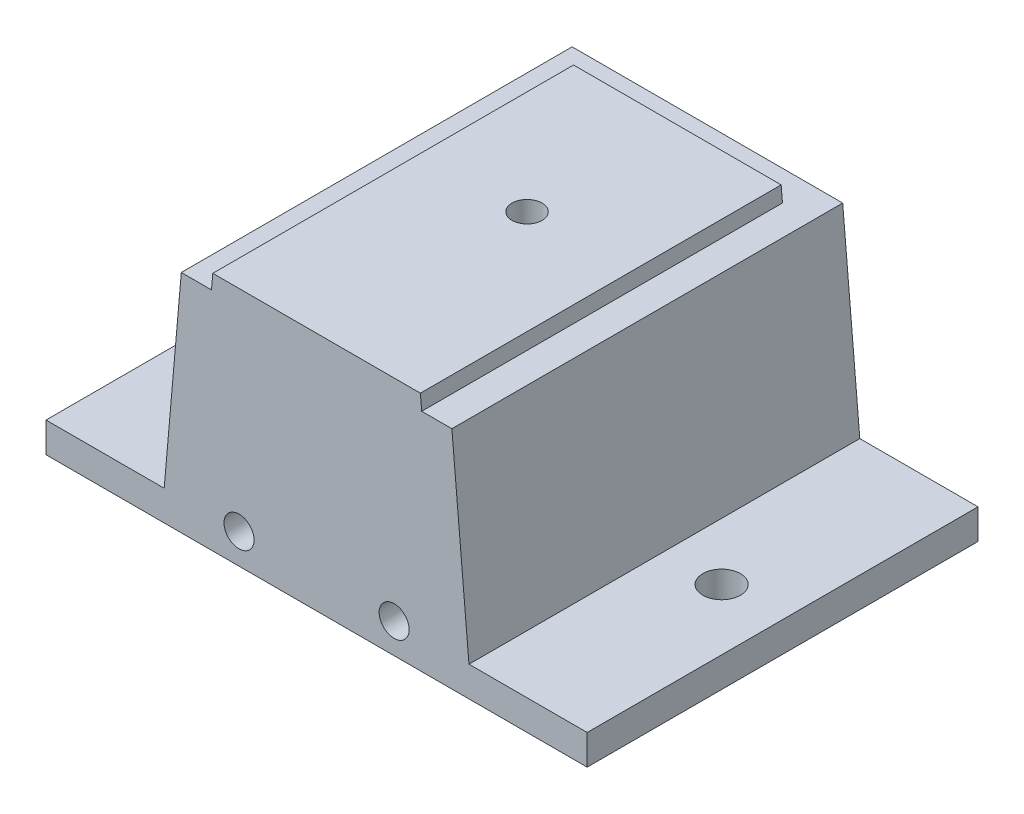
ISO-10303-21;
HEADER;
FILE_DESCRIPTION(('STEP AP214'),'2;1');
FILE_NAME('part.step','',(''),(''),'','','');
FILE_SCHEMA(('AUTOMOTIVE_DESIGN { 1 0 10303 214 1 1 1 1 }'));
ENDSEC;
DATA;
#1=APPLICATION_CONTEXT('core data for automotive mechanical design processes');
#2=APPLICATION_PROTOCOL_DEFINITION('international standard','automotive_design',2000,#1);
#3=PRODUCT_CONTEXT('',#1,'mechanical');
#4=PRODUCT('Part','Part','',(#3));
#5=PRODUCT_RELATED_PRODUCT_CATEGORY('part','',(#4));
#6=PRODUCT_DEFINITION_FORMATION('','',#4);
#7=PRODUCT_DEFINITION_CONTEXT('part definition',#1,'design');
#8=PRODUCT_DEFINITION('design','',#6,#7);
#9=PRODUCT_DEFINITION_SHAPE('','',#8);
#10=(LENGTH_UNIT() NAMED_UNIT(*) SI_UNIT(.MILLI.,.METRE.));
#11=(NAMED_UNIT(*) PLANE_ANGLE_UNIT() SI_UNIT($,.RADIAN.));
#12=(NAMED_UNIT(*) SI_UNIT($,.STERADIAN.) SOLID_ANGLE_UNIT());
#13=UNCERTAINTY_MEASURE_WITH_UNIT(LENGTH_MEASURE(1.E-05),#10,'distance_accuracy_value','');
#14=(GEOMETRIC_REPRESENTATION_CONTEXT(3) GLOBAL_UNCERTAINTY_ASSIGNED_CONTEXT((#13)) GLOBAL_UNIT_ASSIGNED_CONTEXT((#10,
#11,#12)) REPRESENTATION_CONTEXT('',''));
#15=CARTESIAN_POINT('',(0.,0.,0.));
#16=DIRECTION('',(0.,0.,1.));
#17=DIRECTION('',(1.,0.,0.));
#18=AXIS2_PLACEMENT_3D('',#15,#16,#17);
#19=CARTESIAN_POINT('',(57.15,0.,41.275));
#20=DIRECTION('',(0.,1.,0.));
#21=DIRECTION('',(0.,0.,1.));
#22=AXIS2_PLACEMENT_3D('',#19,#20,#21);
#23=PLANE('',#22);
#24=CARTESIAN_POINT('',(44.2781065975275,0.,0.));
#25=DIRECTION('',(0.,1.,0.));
#26=DIRECTION('',(0.,0.,1.));
#27=AXIS2_PLACEMENT_3D('',#24,#25,#26);
#28=CIRCLE('',#27,3.96875);
#29=CARTESIAN_POINT('',(44.2781065975275,0.,3.96875));
#30=VERTEX_POINT('',#29);
#31=EDGE_CURVE('E201',#30,#30,#28,.T.);
#32=ORIENTED_EDGE('',*,*,#31,.T.);
#33=EDGE_LOOP('',(#32));
#34=FACE_BOUND('',#33,.T.);
#35=CARTESIAN_POINT('',(-44.2781065975275,0.,0.));
#36=DIRECTION('',(0.,1.,0.));
#37=DIRECTION('',(0.,0.,-1.));
#38=AXIS2_PLACEMENT_3D('',#35,#36,#37);
#39=CIRCLE('',#38,3.96875);
#40=CARTESIAN_POINT('',(-44.2781065975275,0.,-3.96875));
#41=VERTEX_POINT('',#40);
#42=EDGE_CURVE('E228',#41,#41,#39,.T.);
#43=ORIENTED_EDGE('',*,*,#42,.T.);
#44=EDGE_LOOP('',(#43));
#45=FACE_BOUND('',#44,.T.);
#46=DIRECTION('',(1.,0.,0.));
#47=VECTOR('',#46,1.);
#48=CARTESIAN_POINT('',(57.15,0.,-41.275));
#49=LINE('',#48,#47);
#50=CARTESIAN_POINT('',(-57.15,0.,-41.275));
#51=VERTEX_POINT('',#50);
#52=CARTESIAN_POINT('',(57.15,0.,-41.275));
#53=VERTEX_POINT('',#52);
#54=EDGE_CURVE('E94',#51,#53,#49,.T.);
#55=ORIENTED_EDGE('',*,*,#54,.T.);
#56=DIRECTION('',(0.,0.,-1.));
#57=VECTOR('',#56,1.);
#58=CARTESIAN_POINT('',(57.15,0.,41.275));
#59=LINE('',#58,#57);
#60=CARTESIAN_POINT('',(57.15,0.,41.275));
#61=VERTEX_POINT('',#60);
#62=EDGE_CURVE('E153',#61,#53,#59,.T.);
#63=ORIENTED_EDGE('',*,*,#62,.F.);
#64=DIRECTION('',(1.,0.,0.));
#65=VECTOR('',#64,1.);
#66=CARTESIAN_POINT('',(57.15,0.,41.275));
#67=LINE('',#66,#65);
#68=CARTESIAN_POINT('',(-57.15,0.,41.275));
#69=VERTEX_POINT('',#68);
#70=EDGE_CURVE('E61',#69,#61,#67,.T.);
#71=ORIENTED_EDGE('',*,*,#70,.F.);
#72=DIRECTION('',(0.,0.,-1.));
#73=VECTOR('',#72,1.);
#74=CARTESIAN_POINT('',(-57.15,0.,41.275));
#75=LINE('',#74,#73);
#76=EDGE_CURVE('E149',#69,#51,#75,.T.);
#77=ORIENTED_EDGE('',*,*,#76,.T.);
#78=EDGE_LOOP('',(#55,#63,#71,#77));
#79=FACE_BOUND('',#78,.T.);
#80=DIRECTION('',(0.,0.,-1.));
#81=VECTOR('',#80,1.);
#82=CARTESIAN_POINT('',(-26.3673916320217,0.,41.275));
#83=LINE('',#82,#81);
#84=CARTESIAN_POINT('',(-26.3673916320217,0.,34.925));
#85=VERTEX_POINT('',#84);
#86=CARTESIAN_POINT('',(-26.3673916320217,0.,-34.925));
#87=VERTEX_POINT('',#86);
#88=EDGE_CURVE('E298',#85,#87,#83,.T.);
#89=ORIENTED_EDGE('',*,*,#88,.F.);
#90=DIRECTION('',(1.,0.,0.));
#91=VECTOR('',#90,1.);
#92=CARTESIAN_POINT('',(57.15,0.,34.925));
#93=LINE('',#92,#91);
#94=CARTESIAN_POINT('',(26.3673916320217,0.,34.925));
#95=VERTEX_POINT('',#94);
#96=EDGE_CURVE('E306',#85,#95,#93,.T.);
#97=ORIENTED_EDGE('',*,*,#96,.T.);
#98=DIRECTION('',(0.,0.,-1.));
#99=VECTOR('',#98,1.);
#100=CARTESIAN_POINT('',(26.3673916320217,0.,41.275));
#101=LINE('',#100,#99);
#102=CARTESIAN_POINT('',(26.3673916320217,0.,-34.925));
#103=VERTEX_POINT('',#102);
#104=EDGE_CURVE('E161',#95,#103,#101,.T.);
#105=ORIENTED_EDGE('',*,*,#104,.T.);
#106=DIRECTION('',(1.,0.,0.));
#107=VECTOR('',#106,1.);
#108=CARTESIAN_POINT('',(57.15,0.,-34.925));
#109=LINE('',#108,#107);
#110=EDGE_CURVE('E256',#87,#103,#109,.T.);
#111=ORIENTED_EDGE('',*,*,#110,.F.);
#112=EDGE_LOOP('',(#89,#97,#105,#111));
#113=FACE_BOUND('',#112,.T.);
#114=ADVANCED_FACE('F35',(#34,#45,#79,#113),#23,.F.);
#115=CARTESIAN_POINT('',(57.15,0.,41.275));
#116=DIRECTION('',(-1.,0.,0.));
#117=DIRECTION('',(0.,0.,1.));
#118=AXIS2_PLACEMENT_3D('',#115,#116,#117);
#119=PLANE('',#118);
#120=DIRECTION('',(0.,1.,0.));
#121=VECTOR('',#120,1.);
#122=CARTESIAN_POINT('',(57.15,0.,-41.275));
#123=LINE('',#122,#121);
#124=CARTESIAN_POINT('',(57.15,6.34999999999999,-41.275));
#125=VERTEX_POINT('',#124);
#126=EDGE_CURVE('E157',#53,#125,#123,.T.);
#127=ORIENTED_EDGE('',*,*,#126,.T.);
#128=DIRECTION('',(0.,0.,-1.));
#129=VECTOR('',#128,1.);
#130=CARTESIAN_POINT('',(57.15,6.34999999999999,41.275));
#131=LINE('',#130,#129);
#132=CARTESIAN_POINT('',(57.15,6.34999999999999,41.275));
#133=VERTEX_POINT('',#132);
#134=EDGE_CURVE('E11',#133,#125,#131,.T.);
#135=ORIENTED_EDGE('',*,*,#134,.F.);
#136=DIRECTION('',(0.,1.,0.));
#137=VECTOR('',#136,1.);
#138=CARTESIAN_POINT('',(57.15,0.,41.275));
#139=LINE('',#138,#137);
#140=EDGE_CURVE('E175',#61,#133,#139,.T.);
#141=ORIENTED_EDGE('',*,*,#140,.F.);
#142=ORIENTED_EDGE('',*,*,#62,.T.);
#143=EDGE_LOOP('',(#127,#135,#141,#142));
#144=FACE_BOUND('',#143,.T.);
#145=ADVANCED_FACE('F37',(#144),#119,.F.);
#146=CARTESIAN_POINT('',(57.15,6.34999999999999,41.275));
#147=DIRECTION('',(0.,-1.,0.));
#148=DIRECTION('',(1.,0.,0.));
#149=AXIS2_PLACEMENT_3D('',#146,#147,#148);
#150=PLANE('',#149);
#151=CARTESIAN_POINT('',(44.2781065975275,6.34999999999999,0.));
#152=DIRECTION('',(0.,-1.,0.));
#153=DIRECTION('',(1.,0.,0.));
#154=AXIS2_PLACEMENT_3D('',#151,#152,#153);
#155=CIRCLE('',#154,3.96875);
#156=CARTESIAN_POINT('',(48.2468565975275,6.34999999999999,0.));
#157=VERTEX_POINT('',#156);
#158=EDGE_CURVE('E200',#157,#157,#155,.F.);
#159=ORIENTED_EDGE('',*,*,#158,.F.);
#160=EDGE_LOOP('',(#159));
#161=FACE_BOUND('',#160,.T.);
#162=DIRECTION('',(-1.,0.,0.));
#163=VECTOR('',#162,1.);
#164=CARTESIAN_POINT('',(57.15,6.34999999999999,-41.275));
#165=LINE('',#164,#163);
#166=CARTESIAN_POINT('',(32.1860945870324,6.34999999999999,-41.275));
#167=VERTEX_POINT('',#166);
#168=EDGE_CURVE('E160',#125,#167,#165,.T.);
#169=ORIENTED_EDGE('',*,*,#168,.T.);
#170=DIRECTION('',(0.,0.,-1.));
#171=VECTOR('',#170,1.);
#172=CARTESIAN_POINT('',(32.1860945870324,6.34999999999999,41.275));
#173=LINE('',#172,#171);
#174=CARTESIAN_POINT('',(32.1860945870324,6.34999999999999,41.275));
#175=VERTEX_POINT('',#174);
#176=EDGE_CURVE('E44',#175,#167,#173,.T.);
#177=ORIENTED_EDGE('',*,*,#176,.F.);
#178=DIRECTION('',(-1.,0.,0.));
#179=VECTOR('',#178,1.);
#180=CARTESIAN_POINT('',(57.15,6.34999999999999,41.275));
#181=LINE('',#180,#179);
#182=EDGE_CURVE('E102',#133,#175,#181,.T.);
#183=ORIENTED_EDGE('',*,*,#182,.F.);
#184=ORIENTED_EDGE('',*,*,#134,.T.);
#185=EDGE_LOOP('',(#169,#177,#183,#184));
#186=FACE_BOUND('',#185,.T.);
#187=ADVANCED_FACE('F345',(#161,#186),#150,.F.);
#188=CARTESIAN_POINT('',(32.1860945870324,6.34999999999999,41.275));
#189=DIRECTION('',(-0.996194698091746,-0.0871557427476546,0.));
#190=DIRECTION('',(0.0871557427476546,-0.996194698091746,0.));
#191=AXIS2_PLACEMENT_3D('',#188,#189,#190);
#192=PLANE('',#191);
#193=DIRECTION('',(-0.0871557427476546,0.996194698091746,0.));
#194=VECTOR('',#193,1.);
#195=CARTESIAN_POINT('',(32.1860945870324,6.34999999999999,-41.275));
#196=LINE('',#195,#194);
#197=CARTESIAN_POINT('',(28.575,47.625,-41.275));
#198=VERTEX_POINT('',#197);
#199=EDGE_CURVE('E163',#167,#198,#196,.T.);
#200=ORIENTED_EDGE('',*,*,#199,.T.);
#201=DIRECTION('',(0.,0.,-1.));
#202=VECTOR('',#201,1.);
#203=CARTESIAN_POINT('',(28.575,47.625,41.275));
#204=LINE('',#203,#202);
#205=CARTESIAN_POINT('',(28.575,47.625,41.275));
#206=VERTEX_POINT('',#205);
#207=EDGE_CURVE('E193',#206,#198,#204,.T.);
#208=ORIENTED_EDGE('',*,*,#207,.F.);
#209=DIRECTION('',(-0.0871557427476546,0.996194698091746,0.));
#210=VECTOR('',#209,1.);
#211=CARTESIAN_POINT('',(32.1860945870324,6.34999999999999,41.275));
#212=LINE('',#211,#210);
#213=EDGE_CURVE('E315',#175,#206,#212,.T.);
#214=ORIENTED_EDGE('',*,*,#213,.F.);
#215=ORIENTED_EDGE('',*,*,#176,.T.);
#216=EDGE_LOOP('',(#200,#208,#214,#215));
#217=FACE_BOUND('',#216,.T.);
#218=ADVANCED_FACE('F348',(#217),#192,.F.);
#219=CARTESIAN_POINT('',(21.9229675249049,50.8,41.275));
#220=DIRECTION('',(-0.996194698091746,-0.0871557427476559,0.));
#221=DIRECTION('',(0.0871557427476559,-0.996194698091746,0.));
#222=AXIS2_PLACEMENT_3D('',#219,#220,#221);
#223=PLANE('',#222);
#224=DIRECTION('',(0.,0.,-1.));
#225=VECTOR('',#224,1.);
#226=CARTESIAN_POINT('',(22.2007440315997,47.625,41.275));
#227=LINE('',#226,#225);
#228=CARTESIAN_POINT('',(22.2007440315997,47.625,41.275));
#229=VERTEX_POINT('',#228);
#230=CARTESIAN_POINT('',(22.2007440315997,47.625,-34.925));
#231=VERTEX_POINT('',#230);
#232=EDGE_CURVE('E190',#229,#231,#227,.T.);
#233=ORIENTED_EDGE('',*,*,#232,.T.);
#234=DIRECTION('',(-0.0871557427476559,0.996194698091746,0.));
#235=VECTOR('',#234,1.);
#236=CARTESIAN_POINT('',(21.9229675249049,50.8000000000003,-34.925));
#237=LINE('',#236,#235);
#238=CARTESIAN_POINT('',(21.9229675249049,50.8,-34.925));
#239=VERTEX_POINT('',#238);
#240=EDGE_CURVE('E241',#231,#239,#237,.T.);
#241=ORIENTED_EDGE('',*,*,#240,.T.);
#242=DIRECTION('',(0.,0.,-1.));
#243=VECTOR('',#242,1.);
#244=CARTESIAN_POINT('',(21.9229675249049,50.8,41.275));
#245=LINE('',#244,#243);
#246=CARTESIAN_POINT('',(21.9229675249049,50.8,41.275));
#247=VERTEX_POINT('',#246);
#248=EDGE_CURVE('E187',#247,#239,#245,.T.);
#249=ORIENTED_EDGE('',*,*,#248,.F.);
#250=DIRECTION('',(-0.0871557427476559,0.996194698091746,0.));
#251=VECTOR('',#250,1.);
#252=CARTESIAN_POINT('',(21.9229675249049,50.8,41.275));
#253=LINE('',#252,#251);
#254=EDGE_CURVE('E319',#229,#247,#253,.T.);
#255=ORIENTED_EDGE('',*,*,#254,.F.);
#256=EDGE_LOOP('',(#233,#241,#249,#255));
#257=FACE_BOUND('',#256,.T.);
#258=ADVANCED_FACE('F356',(#257),#223,.F.);
#259=CARTESIAN_POINT('',(-21.922967524905,50.8,41.275));
#260=DIRECTION('',(0.,-1.,0.));
#261=DIRECTION('',(0.,0.,-1.));
#262=AXIS2_PLACEMENT_3D('',#259,#260,#261);
#263=PLANE('',#262);
#264=CARTESIAN_POINT('',(0.,50.8,-3.17500000000004));
#265=DIRECTION('',(0.,1.,0.));
#266=DIRECTION('',(0.,0.,1.));
#267=AXIS2_PLACEMENT_3D('',#264,#265,#266);
#268=CIRCLE('',#267,3.17499999999999);
#269=CARTESIAN_POINT('',(0.,50.8,0.));
#270=VERTEX_POINT('',#269);
#271=EDGE_CURVE('E211',#270,#270,#268,.T.);
#272=ORIENTED_EDGE('',*,*,#271,.F.);
#273=EDGE_LOOP('',(#272));
#274=FACE_BOUND('',#273,.T.);
#275=ORIENTED_EDGE('',*,*,#248,.T.);
#276=DIRECTION('',(1.,0.,0.));
#277=VECTOR('',#276,1.);
#278=CARTESIAN_POINT('',(-57.15,50.8,-34.925));
#279=LINE('',#278,#277);
#280=CARTESIAN_POINT('',(-21.922967524905,50.8,-34.925));
#281=VERTEX_POINT('',#280);
#282=EDGE_CURVE('E203',#281,#239,#279,.T.);
#283=ORIENTED_EDGE('',*,*,#282,.F.);
#284=DIRECTION('',(0.,0.,-1.));
#285=VECTOR('',#284,1.);
#286=CARTESIAN_POINT('',(-21.922967524905,50.8,41.275));
#287=LINE('',#286,#285);
#288=CARTESIAN_POINT('',(-21.922967524905,50.8,41.275));
#289=VERTEX_POINT('',#288);
#290=EDGE_CURVE('E184',#289,#281,#287,.T.);
#291=ORIENTED_EDGE('',*,*,#290,.F.);
#292=DIRECTION('',(-1.,0.,0.));
#293=VECTOR('',#292,1.);
#294=CARTESIAN_POINT('',(-21.922967524905,50.8,41.275));
#295=LINE('',#294,#293);
#296=EDGE_CURVE('E321',#247,#289,#295,.T.);
#297=ORIENTED_EDGE('',*,*,#296,.F.);
#298=EDGE_LOOP('',(#275,#283,#291,#297));
#299=FACE_BOUND('',#298,.T.);
#300=ADVANCED_FACE('F361',(#274,#299),#263,.F.);
#301=CARTESIAN_POINT('',(-22.2007440315997,47.625,41.275));
#302=DIRECTION('',(0.996194698091746,-0.0871557427476537,0.));
#303=DIRECTION('',(0.0871557427476537,0.996194698091746,0.));
#304=AXIS2_PLACEMENT_3D('',#301,#302,#303);
#305=PLANE('',#304);
#306=ORIENTED_EDGE('',*,*,#290,.T.);
#307=DIRECTION('',(-0.0871557427476537,-0.996194698091746,0.));
#308=VECTOR('',#307,1.);
#309=CARTESIAN_POINT('',(-22.2007440315997,47.6250000000003,-34.925));
#310=LINE('',#309,#308);
#311=CARTESIAN_POINT('',(-22.2007440315997,47.625,-34.925));
#312=VERTEX_POINT('',#311);
#313=EDGE_CURVE('E236',#281,#312,#310,.T.);
#314=ORIENTED_EDGE('',*,*,#313,.T.);
#315=DIRECTION('',(0.,0.,-1.));
#316=VECTOR('',#315,1.);
#317=CARTESIAN_POINT('',(-22.2007440315997,47.625,41.275));
#318=LINE('',#317,#316);
#319=CARTESIAN_POINT('',(-22.2007440315997,47.625,41.275));
#320=VERTEX_POINT('',#319);
#321=EDGE_CURVE('E181',#320,#312,#318,.T.);
#322=ORIENTED_EDGE('',*,*,#321,.F.);
#323=DIRECTION('',(-0.0871557427476537,-0.996194698091746,0.));
#324=VECTOR('',#323,1.);
#325=CARTESIAN_POINT('',(-22.2007440315997,47.625,41.275));
#326=LINE('',#325,#324);
#327=EDGE_CURVE('E323',#289,#320,#326,.T.);
#328=ORIENTED_EDGE('',*,*,#327,.F.);
#329=EDGE_LOOP('',(#306,#314,#322,#328));
#330=FACE_BOUND('',#329,.T.);
#331=ADVANCED_FACE('F364',(#330),#305,.F.);
#332=CARTESIAN_POINT('',(-28.575,47.625,41.275));
#333=DIRECTION('',(0.,-1.,0.));
#334=DIRECTION('',(0.,0.,-1.));
#335=AXIS2_PLACEMENT_3D('',#332,#333,#334);
#336=PLANE('',#335);
#337=ORIENTED_EDGE('',*,*,#321,.T.);
#338=DIRECTION('',(1.,0.,0.));
#339=VECTOR('',#338,1.);
#340=CARTESIAN_POINT('',(-57.15,47.625,-34.925));
#341=LINE('',#340,#339);
#342=EDGE_CURVE('E233',#312,#231,#341,.T.);
#343=ORIENTED_EDGE('',*,*,#342,.T.);
#344=ORIENTED_EDGE('',*,*,#232,.F.);
#345=DIRECTION('',(-1.,0.,0.));
#346=VECTOR('',#345,1.);
#347=CARTESIAN_POINT('',(22.2007440315997,47.625,41.275));
#348=LINE('',#347,#346);
#349=EDGE_CURVE('E317',#206,#229,#348,.T.);
#350=ORIENTED_EDGE('',*,*,#349,.F.);
#351=ORIENTED_EDGE('',*,*,#207,.T.);
#352=DIRECTION('',(-1.,0.,0.));
#353=VECTOR('',#352,1.);
#354=CARTESIAN_POINT('',(-28.575,47.625,-41.275));
#355=LINE('',#354,#353);
#356=CARTESIAN_POINT('',(-28.575,47.625,-41.275));
#357=VERTEX_POINT('',#356);
#358=EDGE_CURVE('E166',#198,#357,#355,.T.);
#359=ORIENTED_EDGE('',*,*,#358,.T.);
#360=DIRECTION('',(0.,0.,-1.));
#361=VECTOR('',#360,1.);
#362=CARTESIAN_POINT('',(-28.575,47.625,41.275));
#363=LINE('',#362,#361);
#364=CARTESIAN_POINT('',(-28.575,47.625,41.275));
#365=VERTEX_POINT('',#364);
#366=EDGE_CURVE('E179',#365,#357,#363,.T.);
#367=ORIENTED_EDGE('',*,*,#366,.F.);
#368=DIRECTION('',(-1.,0.,0.));
#369=VECTOR('',#368,1.);
#370=CARTESIAN_POINT('',(-28.575,47.625,41.275));
#371=LINE('',#370,#369);
#372=EDGE_CURVE('E325',#320,#365,#371,.T.);
#373=ORIENTED_EDGE('',*,*,#372,.F.);
#374=EDGE_LOOP('',(#337,#343,#344,#350,#351,#359,#367,#373));
#375=FACE_BOUND('',#374,.T.);
#376=ADVANCED_FACE('F331',(#375),#336,.F.);
#377=CARTESIAN_POINT('',(-32.1860945870324,6.34999999999999,41.275));
#378=DIRECTION('',(0.996194698091746,-0.0871557427476543,0.));
#379=DIRECTION('',(0.0871557427476543,0.996194698091746,0.));
#380=AXIS2_PLACEMENT_3D('',#377,#378,#379);
#381=PLANE('',#380);
#382=DIRECTION('',(-0.0871557427476543,-0.996194698091746,0.));
#383=VECTOR('',#382,1.);
#384=CARTESIAN_POINT('',(-32.1860945870324,6.34999999999999,-41.275));
#385=LINE('',#384,#383);
#386=CARTESIAN_POINT('',(-32.1860945870324,6.34999999999999,-41.275));
#387=VERTEX_POINT('',#386);
#388=EDGE_CURVE('E169',#357,#387,#385,.T.);
#389=ORIENTED_EDGE('',*,*,#388,.T.);
#390=DIRECTION('',(0.,0.,-1.));
#391=VECTOR('',#390,1.);
#392=CARTESIAN_POINT('',(-32.1860945870324,6.34999999999999,41.275));
#393=LINE('',#392,#391);
#394=CARTESIAN_POINT('',(-32.1860945870324,6.34999999999999,41.275));
#395=VERTEX_POINT('',#394);
#396=EDGE_CURVE('E148',#395,#387,#393,.T.);
#397=ORIENTED_EDGE('',*,*,#396,.F.);
#398=DIRECTION('',(-0.0871557427476543,-0.996194698091746,0.));
#399=VECTOR('',#398,1.);
#400=CARTESIAN_POINT('',(-32.1860945870324,6.34999999999999,41.275));
#401=LINE('',#400,#399);
#402=EDGE_CURVE('E136',#365,#395,#401,.T.);
#403=ORIENTED_EDGE('',*,*,#402,.F.);
#404=ORIENTED_EDGE('',*,*,#366,.T.);
#405=EDGE_LOOP('',(#389,#397,#403,#404));
#406=FACE_BOUND('',#405,.T.);
#407=ADVANCED_FACE('F335',(#406),#381,.F.);
#408=CARTESIAN_POINT('',(-57.15,6.34999999999999,41.275));
#409=DIRECTION('',(0.,-1.,0.));
#410=DIRECTION('',(1.,0.,0.));
#411=AXIS2_PLACEMENT_3D('',#408,#409,#410);
#412=PLANE('',#411);
#413=CARTESIAN_POINT('',(-44.2781065975275,6.34999999999999,0.));
#414=DIRECTION('',(0.,-1.,0.));
#415=DIRECTION('',(1.,0.,0.));
#416=AXIS2_PLACEMENT_3D('',#413,#414,#415);
#417=CIRCLE('',#416,3.96875);
#418=CARTESIAN_POINT('',(-40.3093565975275,6.34999999999999,0.));
#419=VERTEX_POINT('',#418);
#420=EDGE_CURVE('E197',#419,#419,#417,.F.);
#421=ORIENTED_EDGE('',*,*,#420,.F.);
#422=EDGE_LOOP('',(#421));
#423=FACE_BOUND('',#422,.T.);
#424=DIRECTION('',(-1.,0.,0.));
#425=VECTOR('',#424,1.);
#426=CARTESIAN_POINT('',(-57.15,6.34999999999999,-41.275));
#427=LINE('',#426,#425);
#428=CARTESIAN_POINT('',(-57.15,6.34999999999999,-41.275));
#429=VERTEX_POINT('',#428);
#430=EDGE_CURVE('E145',#387,#429,#427,.T.);
#431=ORIENTED_EDGE('',*,*,#430,.T.);
#432=DIRECTION('',(0.,0.,-1.));
#433=VECTOR('',#432,1.);
#434=CARTESIAN_POINT('',(-57.15,6.34999999999999,41.275));
#435=LINE('',#434,#433);
#436=CARTESIAN_POINT('',(-57.15,6.34999999999999,41.275));
#437=VERTEX_POINT('',#436);
#438=EDGE_CURVE('E142',#437,#429,#435,.T.);
#439=ORIENTED_EDGE('',*,*,#438,.F.);
#440=DIRECTION('',(-1.,0.,0.));
#441=VECTOR('',#440,1.);
#442=CARTESIAN_POINT('',(-57.15,6.34999999999999,41.275));
#443=LINE('',#442,#441);
#444=EDGE_CURVE('E129',#395,#437,#443,.T.);
#445=ORIENTED_EDGE('',*,*,#444,.F.);
#446=ORIENTED_EDGE('',*,*,#396,.T.);
#447=EDGE_LOOP('',(#431,#439,#445,#446));
#448=FACE_BOUND('',#447,.T.);
#449=ADVANCED_FACE('F143',(#423,#448),#412,.F.);
#450=CARTESIAN_POINT('',(-57.15,0.,41.275));
#451=DIRECTION('',(1.,0.,0.));
#452=DIRECTION('',(0.,0.,-1.));
#453=AXIS2_PLACEMENT_3D('',#450,#451,#452);
#454=PLANE('',#453);
#455=DIRECTION('',(0.,-1.,0.));
#456=VECTOR('',#455,1.);
#457=CARTESIAN_POINT('',(-57.15,0.,-41.275));
#458=LINE('',#457,#456);
#459=EDGE_CURVE('E172',#429,#51,#458,.T.);
#460=ORIENTED_EDGE('',*,*,#459,.T.);
#461=ORIENTED_EDGE('',*,*,#76,.F.);
#462=DIRECTION('',(0.,-1.,0.));
#463=VECTOR('',#462,1.);
#464=CARTESIAN_POINT('',(-57.15,0.,41.275));
#465=LINE('',#464,#463);
#466=EDGE_CURVE('E133',#437,#69,#465,.T.);
#467=ORIENTED_EDGE('',*,*,#466,.F.);
#468=ORIENTED_EDGE('',*,*,#438,.T.);
#469=EDGE_LOOP('',(#460,#461,#467,#468));
#470=FACE_BOUND('',#469,.T.);
#471=ADVANCED_FACE('F151',(#470),#454,.F.);
#472=CARTESIAN_POINT('',(0.,0.,41.275));
#473=DIRECTION('',(0.,0.,1.));
#474=DIRECTION('',(1.,0.,0.));
#475=AXIS2_PLACEMENT_3D('',#472,#473,#474);
#476=PLANE('',#475);
#477=CARTESIAN_POINT('',(16.3820410765891,6.35000000000003,41.275));
#478=DIRECTION('',(0.,0.,-1.));
#479=DIRECTION('',(-1.,0.,0.));
#480=AXIS2_PLACEMENT_3D('',#477,#478,#479);
#481=CIRCLE('',#480,3.17499999999999);
#482=CARTESIAN_POINT('',(13.2070410765891,6.35000000000003,41.275));
#483=VERTEX_POINT('',#482);
#484=EDGE_CURVE('E677',#483,#483,#481,.T.);
#485=ORIENTED_EDGE('',*,*,#484,.T.);
#486=EDGE_LOOP('',(#485));
#487=FACE_BOUND('',#486,.T.);
#488=CARTESIAN_POINT('',(-16.3820410765891,6.35000000000002,41.275));
#489=DIRECTION('',(0.,0.,-1.));
#490=DIRECTION('',(-1.,0.,0.));
#491=AXIS2_PLACEMENT_3D('',#488,#489,#490);
#492=CIRCLE('',#491,3.17499999999999);
#493=CARTESIAN_POINT('',(-19.5570410765891,6.35000000000002,41.275));
#494=VERTEX_POINT('',#493);
#495=EDGE_CURVE('E207',#494,#494,#492,.T.);
#496=ORIENTED_EDGE('',*,*,#495,.T.);
#497=EDGE_LOOP('',(#496));
#498=FACE_BOUND('',#497,.T.);
#499=ORIENTED_EDGE('',*,*,#140,.T.);
#500=ORIENTED_EDGE('',*,*,#182,.T.);
#501=ORIENTED_EDGE('',*,*,#213,.T.);
#502=ORIENTED_EDGE('',*,*,#349,.T.);
#503=ORIENTED_EDGE('',*,*,#254,.T.);
#504=ORIENTED_EDGE('',*,*,#296,.T.);
#505=ORIENTED_EDGE('',*,*,#327,.T.);
#506=ORIENTED_EDGE('',*,*,#372,.T.);
#507=ORIENTED_EDGE('',*,*,#402,.T.);
#508=ORIENTED_EDGE('',*,*,#444,.T.);
#509=ORIENTED_EDGE('',*,*,#466,.T.);
#510=ORIENTED_EDGE('',*,*,#70,.T.);
#511=EDGE_LOOP('',(#499,#500,#501,#502,#503,#504,#505,#506,#507,#508,#509,#510));
#512=FACE_BOUND('',#511,.T.);
#513=ADVANCED_FACE('F131',(#487,#498,#512),#476,.T.);
#514=CARTESIAN_POINT('',(0.,0.,-41.275));
#515=DIRECTION('',(0.,0.,1.));
#516=DIRECTION('',(1.,0.,0.));
#517=AXIS2_PLACEMENT_3D('',#514,#515,#516);
#518=PLANE('',#517);
#519=CARTESIAN_POINT('',(16.3820410765891,6.35000000000003,-41.275));
#520=DIRECTION('',(0.,0.,-1.));
#521=DIRECTION('',(-1.,0.,0.));
#522=AXIS2_PLACEMENT_3D('',#519,#520,#521);
#523=CIRCLE('',#522,3.17499999999999);
#524=CARTESIAN_POINT('',(13.2070410765891,6.35000000000003,-41.275));
#525=VERTEX_POINT('',#524);
#526=EDGE_CURVE('E682',#525,#525,#523,.T.);
#527=ORIENTED_EDGE('',*,*,#526,.F.);
#528=EDGE_LOOP('',(#527));
#529=FACE_BOUND('',#528,.T.);
#530=CARTESIAN_POINT('',(-16.3820410765891,6.35000000000002,-41.275));
#531=DIRECTION('',(0.,0.,-1.));
#532=DIRECTION('',(-1.,0.,0.));
#533=AXIS2_PLACEMENT_3D('',#530,#531,#532);
#534=CIRCLE('',#533,3.17499999999999);
#535=CARTESIAN_POINT('',(-19.5570410765891,6.35000000000002,-41.275));
#536=VERTEX_POINT('',#535);
#537=EDGE_CURVE('E214',#536,#536,#534,.T.);
#538=ORIENTED_EDGE('',*,*,#537,.F.);
#539=EDGE_LOOP('',(#538));
#540=FACE_BOUND('',#539,.T.);
#541=ORIENTED_EDGE('',*,*,#358,.F.);
#542=ORIENTED_EDGE('',*,*,#199,.F.);
#543=ORIENTED_EDGE('',*,*,#168,.F.);
#544=ORIENTED_EDGE('',*,*,#126,.F.);
#545=ORIENTED_EDGE('',*,*,#54,.F.);
#546=ORIENTED_EDGE('',*,*,#459,.F.);
#547=ORIENTED_EDGE('',*,*,#430,.F.);
#548=ORIENTED_EDGE('',*,*,#388,.F.);
#549=EDGE_LOOP('',(#541,#542,#543,#544,#545,#546,#547,#548));
#550=FACE_BOUND('',#549,.T.);
#551=ADVANCED_FACE('F337',(#529,#540,#550),#518,.F.);
#552=CARTESIAN_POINT('',(25.8602582541498,5.79656103355238,41.275));
#553=DIRECTION('',(-0.996194698091746,-0.0871557427476546,0.));
#554=DIRECTION('',(0.0871557427476546,-0.996194698091746,0.));
#555=AXIS2_PLACEMENT_3D('',#552,#553,#554);
#556=PLANE('',#555);
#557=DIRECTION('',(-0.0871557427476546,0.996194698091746,0.));
#558=VECTOR('',#557,1.);
#559=CARTESIAN_POINT('',(25.8602582541498,5.79656103355238,-34.925));
#560=LINE('',#559,#558);
#561=CARTESIAN_POINT('',(22.7562970449893,41.275,-34.925));
#562=VERTEX_POINT('',#561);
#563=EDGE_CURVE('E244',#103,#562,#560,.T.);
#564=ORIENTED_EDGE('',*,*,#563,.F.);
#565=ORIENTED_EDGE('',*,*,#104,.F.);
#566=DIRECTION('',(-0.0871557427476546,0.996194698091746,0.));
#567=VECTOR('',#566,1.);
#568=CARTESIAN_POINT('',(25.8602582541498,5.79656103355238,34.925));
#569=LINE('',#568,#567);
#570=CARTESIAN_POINT('',(22.7562970449893,41.275,34.925));
#571=VERTEX_POINT('',#570);
#572=EDGE_CURVE('E52',#95,#571,#569,.T.);
#573=ORIENTED_EDGE('',*,*,#572,.T.);
#574=DIRECTION('',(0.,0.,-1.));
#575=VECTOR('',#574,1.);
#576=CARTESIAN_POINT('',(22.7562970449893,41.275,41.275));
#577=LINE('',#576,#575);
#578=EDGE_CURVE('E247',#571,#562,#577,.T.);
#579=ORIENTED_EDGE('',*,*,#578,.T.);
#580=EDGE_LOOP('',(#564,#565,#573,#579));
#581=FACE_BOUND('',#580,.T.);
#582=ADVANCED_FACE('F413',(#581),#556,.T.);
#583=CARTESIAN_POINT('',(22.2007440315997,41.275,41.275));
#584=DIRECTION('',(0.,-1.,0.));
#585=DIRECTION('',(0.,0.,-1.));
#586=AXIS2_PLACEMENT_3D('',#583,#584,#585);
#587=PLANE('',#586);
#588=DIRECTION('',(-1.,0.,0.));
#589=VECTOR('',#588,1.);
#590=CARTESIAN_POINT('',(22.2007440315997,41.275,-34.925));
#591=LINE('',#590,#589);
#592=CARTESIAN_POINT('',(16.3820410765891,41.275,-34.925));
#593=VERTEX_POINT('',#592);
#594=EDGE_CURVE('E250',#562,#593,#591,.T.);
#595=ORIENTED_EDGE('',*,*,#594,.F.);
#596=ORIENTED_EDGE('',*,*,#578,.F.);
#597=DIRECTION('',(-1.,0.,0.));
#598=VECTOR('',#597,1.);
#599=CARTESIAN_POINT('',(22.2007440315997,41.275,34.925));
#600=LINE('',#599,#598);
#601=CARTESIAN_POINT('',(16.3820410765891,41.275,34.925));
#602=VERTEX_POINT('',#601);
#603=EDGE_CURVE('E255',#571,#602,#600,.T.);
#604=ORIENTED_EDGE('',*,*,#603,.T.);
#605=DIRECTION('',(0.,0.,-1.));
#606=VECTOR('',#605,1.);
#607=CARTESIAN_POINT('',(16.3820410765891,41.275,41.275));
#608=LINE('',#607,#606);
#609=EDGE_CURVE('E253',#602,#593,#608,.T.);
#610=ORIENTED_EDGE('',*,*,#609,.T.);
#611=EDGE_LOOP('',(#595,#596,#604,#610));
#612=FACE_BOUND('',#611,.T.);
#613=ADVANCED_FACE('F419',(#612),#587,.T.);
#614=CARTESIAN_POINT('',(15.5971311920224,50.2465610335524,41.275));
#615=DIRECTION('',(-0.996194698091746,-0.0871557427476559,0.));
#616=DIRECTION('',(0.0871557427476559,-0.996194698091746,0.));
#617=AXIS2_PLACEMENT_3D('',#614,#615,#616);
#618=PLANE('',#617);
#619=DIRECTION('',(-0.0871557427476559,0.996194698091746,0.));
#620=VECTOR('',#619,1.);
#621=CARTESIAN_POINT('',(15.5971311920224,50.2465610335524,-34.925));
#622=LINE('',#621,#620);
#623=CARTESIAN_POINT('',(16.1042645698943,44.45,-34.925));
#624=VERTEX_POINT('',#623);
#625=EDGE_CURVE('E259',#593,#624,#622,.T.);
#626=ORIENTED_EDGE('',*,*,#625,.F.);
#627=ORIENTED_EDGE('',*,*,#609,.F.);
#628=DIRECTION('',(-0.0871557427476559,0.996194698091746,0.));
#629=VECTOR('',#628,1.);
#630=CARTESIAN_POINT('',(15.5971311920224,50.2465610335524,34.925));
#631=LINE('',#630,#629);
#632=CARTESIAN_POINT('',(16.1042645698943,44.45,34.925));
#633=VERTEX_POINT('',#632);
#634=EDGE_CURVE('E265',#602,#633,#631,.T.);
#635=ORIENTED_EDGE('',*,*,#634,.T.);
#636=DIRECTION('',(0.,0.,-1.));
#637=VECTOR('',#636,1.);
#638=CARTESIAN_POINT('',(16.1042645698943,44.45,41.275));
#639=LINE('',#638,#637);
#640=EDGE_CURVE('E262',#633,#624,#639,.T.);
#641=ORIENTED_EDGE('',*,*,#640,.T.);
#642=EDGE_LOOP('',(#626,#627,#635,#641));
#643=FACE_BOUND('',#642,.T.);
#644=ADVANCED_FACE('F422',(#643),#618,.T.);
#645=CARTESIAN_POINT('',(-21.922967524905,44.45,41.275));
#646=DIRECTION('',(0.,-1.,0.));
#647=DIRECTION('',(0.,0.,-1.));
#648=AXIS2_PLACEMENT_3D('',#645,#646,#647);
#649=PLANE('',#648);
#650=CARTESIAN_POINT('',(0.,44.45,-3.17500000000004));
#651=DIRECTION('',(0.,-1.,0.));
#652=DIRECTION('',(0.,0.,-1.));
#653=AXIS2_PLACEMENT_3D('',#650,#651,#652);
#654=CIRCLE('',#653,3.17499999999999);
#655=CARTESIAN_POINT('',(0.,44.45,-6.35000000000003));
#656=VERTEX_POINT('',#655);
#657=EDGE_CURVE('E225',#656,#656,#654,.T.);
#658=ORIENTED_EDGE('',*,*,#657,.F.);
#659=EDGE_LOOP('',(#658));
#660=FACE_BOUND('',#659,.T.);
#661=DIRECTION('',(-1.,0.,0.));
#662=VECTOR('',#661,1.);
#663=CARTESIAN_POINT('',(-21.922967524905,44.45,-34.925));
#664=LINE('',#663,#662);
#665=CARTESIAN_POINT('',(-16.1042645698943,44.45,-34.925));
#666=VERTEX_POINT('',#665);
#667=EDGE_CURVE('E268',#624,#666,#664,.T.);
#668=ORIENTED_EDGE('',*,*,#667,.F.);
#669=ORIENTED_EDGE('',*,*,#640,.F.);
#670=DIRECTION('',(-1.,0.,0.));
#671=VECTOR('',#670,1.);
#672=CARTESIAN_POINT('',(-21.922967524905,44.45,34.925));
#673=LINE('',#672,#671);
#674=CARTESIAN_POINT('',(-16.1042645698943,44.45,34.925));
#675=VERTEX_POINT('',#674);
#676=EDGE_CURVE('E274',#633,#675,#673,.T.);
#677=ORIENTED_EDGE('',*,*,#676,.T.);
#678=DIRECTION('',(0.,0.,-1.));
#679=VECTOR('',#678,1.);
#680=CARTESIAN_POINT('',(-16.1042645698943,44.45,41.275));
#681=LINE('',#680,#679);
#682=EDGE_CURVE('E271',#675,#666,#681,.T.);
#683=ORIENTED_EDGE('',*,*,#682,.T.);
#684=EDGE_LOOP('',(#668,#669,#677,#683));
#685=FACE_BOUND('',#684,.T.);
#686=ADVANCED_FACE('F427',(#660,#685),#649,.T.);
#687=CARTESIAN_POINT('',(-15.8749076987172,47.0715610335524,41.275));
#688=DIRECTION('',(0.996194698091746,-0.0871557427476537,0.));
#689=DIRECTION('',(0.0871557427476537,0.996194698091746,0.));
#690=AXIS2_PLACEMENT_3D('',#687,#688,#689);
#691=PLANE('',#690);
#692=DIRECTION('',(-0.0871557427476537,-0.996194698091746,0.));
#693=VECTOR('',#692,1.);
#694=CARTESIAN_POINT('',(-15.8749076987172,47.0715610335524,-34.925));
#695=LINE('',#694,#693);
#696=CARTESIAN_POINT('',(-16.3820410765891,41.275,-34.925));
#697=VERTEX_POINT('',#696);
#698=EDGE_CURVE('E277',#666,#697,#695,.T.);
#699=ORIENTED_EDGE('',*,*,#698,.F.);
#700=ORIENTED_EDGE('',*,*,#682,.F.);
#701=DIRECTION('',(-0.0871557427476537,-0.996194698091746,0.));
#702=VECTOR('',#701,1.);
#703=CARTESIAN_POINT('',(-15.8749076987172,47.0715610335524,34.925));
#704=LINE('',#703,#702);
#705=CARTESIAN_POINT('',(-16.3820410765891,41.275,34.925));
#706=VERTEX_POINT('',#705);
#707=EDGE_CURVE('E283',#675,#706,#704,.T.);
#708=ORIENTED_EDGE('',*,*,#707,.T.);
#709=DIRECTION('',(0.,0.,-1.));
#710=VECTOR('',#709,1.);
#711=CARTESIAN_POINT('',(-16.3820410765891,41.275,41.275));
#712=LINE('',#711,#710);
#713=EDGE_CURVE('E280',#706,#697,#712,.T.);
#714=ORIENTED_EDGE('',*,*,#713,.T.);
#715=EDGE_LOOP('',(#699,#700,#708,#714));
#716=FACE_BOUND('',#715,.T.);
#717=ADVANCED_FACE('F432',(#716),#691,.T.);
#718=CARTESIAN_POINT('',(-28.575,41.275,41.275));
#719=DIRECTION('',(0.,-1.,0.));
#720=DIRECTION('',(0.,0.,-1.));
#721=AXIS2_PLACEMENT_3D('',#718,#719,#720);
#722=PLANE('',#721);
#723=DIRECTION('',(-1.,0.,0.));
#724=VECTOR('',#723,1.);
#725=CARTESIAN_POINT('',(-28.575,41.275,-34.925));
#726=LINE('',#725,#724);
#727=CARTESIAN_POINT('',(-22.7562970449893,41.275,-34.925));
#728=VERTEX_POINT('',#727);
#729=EDGE_CURVE('E286',#697,#728,#726,.T.);
#730=ORIENTED_EDGE('',*,*,#729,.F.);
#731=ORIENTED_EDGE('',*,*,#713,.F.);
#732=DIRECTION('',(-1.,0.,0.));
#733=VECTOR('',#732,1.);
#734=CARTESIAN_POINT('',(-28.575,41.275,34.925));
#735=LINE('',#734,#733);
#736=CARTESIAN_POINT('',(-22.7562970449893,41.275,34.925));
#737=VERTEX_POINT('',#736);
#738=EDGE_CURVE('E292',#706,#737,#735,.T.);
#739=ORIENTED_EDGE('',*,*,#738,.T.);
#740=DIRECTION('',(0.,0.,-1.));
#741=VECTOR('',#740,1.);
#742=CARTESIAN_POINT('',(-22.7562970449893,41.275,41.275));
#743=LINE('',#742,#741);
#744=EDGE_CURVE('E289',#737,#728,#743,.T.);
#745=ORIENTED_EDGE('',*,*,#744,.T.);
#746=EDGE_LOOP('',(#730,#731,#739,#745));
#747=FACE_BOUND('',#746,.T.);
#748=ADVANCED_FACE('F436',(#747),#722,.T.);
#749=CARTESIAN_POINT('',(-25.8602582541498,5.79656103355238,41.275));
#750=DIRECTION('',(0.996194698091746,-0.0871557427476543,0.));
#751=DIRECTION('',(0.0871557427476543,0.996194698091746,0.));
#752=AXIS2_PLACEMENT_3D('',#749,#750,#751);
#753=PLANE('',#752);
#754=DIRECTION('',(-0.0871557427476543,-0.996194698091746,0.));
#755=VECTOR('',#754,1.);
#756=CARTESIAN_POINT('',(-25.8602582541498,5.79656103355238,-34.925));
#757=LINE('',#756,#755);
#758=EDGE_CURVE('E295',#728,#87,#757,.T.);
#759=ORIENTED_EDGE('',*,*,#758,.F.);
#760=ORIENTED_EDGE('',*,*,#744,.F.);
#761=DIRECTION('',(-0.0871557427476543,-0.996194698091746,0.));
#762=VECTOR('',#761,1.);
#763=CARTESIAN_POINT('',(-25.8602582541498,5.79656103355238,34.925));
#764=LINE('',#763,#762);
#765=EDGE_CURVE('E301',#737,#85,#764,.T.);
#766=ORIENTED_EDGE('',*,*,#765,.T.);
#767=ORIENTED_EDGE('',*,*,#88,.T.);
#768=EDGE_LOOP('',(#759,#760,#766,#767));
#769=FACE_BOUND('',#768,.T.);
#770=ADVANCED_FACE('F405',(#769),#753,.T.);
#771=CARTESIAN_POINT('',(0.,0.,34.925));
#772=DIRECTION('',(0.,0.,1.));
#773=DIRECTION('',(1.,0.,0.));
#774=AXIS2_PLACEMENT_3D('',#771,#772,#773);
#775=PLANE('',#774);
#776=CARTESIAN_POINT('',(16.3820410765891,6.35000000000003,34.925));
#777=DIRECTION('',(0.,0.,1.));
#778=DIRECTION('',(1.,0.,0.));
#779=AXIS2_PLACEMENT_3D('',#776,#777,#778);
#780=CIRCLE('',#779,3.17499999999999);
#781=CARTESIAN_POINT('',(19.5570410765891,6.35000000000003,34.925));
#782=VERTEX_POINT('',#781);
#783=EDGE_CURVE('E219',#782,#782,#780,.T.);
#784=ORIENTED_EDGE('',*,*,#783,.T.);
#785=EDGE_LOOP('',(#784));
#786=FACE_BOUND('',#785,.T.);
#787=CARTESIAN_POINT('',(-16.3820410765891,6.35000000000002,34.925));
#788=DIRECTION('',(0.,0.,1.));
#789=DIRECTION('',(1.,0.,0.));
#790=AXIS2_PLACEMENT_3D('',#787,#788,#789);
#791=CIRCLE('',#790,3.17499999999999);
#792=CARTESIAN_POINT('',(-13.2070410765891,6.35000000000002,34.925));
#793=VERTEX_POINT('',#792);
#794=EDGE_CURVE('E206',#793,#793,#791,.T.);
#795=ORIENTED_EDGE('',*,*,#794,.T.);
#796=EDGE_LOOP('',(#795));
#797=FACE_BOUND('',#796,.T.);
#798=ORIENTED_EDGE('',*,*,#765,.F.);
#799=ORIENTED_EDGE('',*,*,#738,.F.);
#800=ORIENTED_EDGE('',*,*,#707,.F.);
#801=ORIENTED_EDGE('',*,*,#676,.F.);
#802=ORIENTED_EDGE('',*,*,#634,.F.);
#803=ORIENTED_EDGE('',*,*,#603,.F.);
#804=ORIENTED_EDGE('',*,*,#572,.F.);
#805=ORIENTED_EDGE('',*,*,#96,.F.);
#806=EDGE_LOOP('',(#798,#799,#800,#801,#802,#803,#804,#805));
#807=FACE_BOUND('',#806,.T.);
#808=ADVANCED_FACE('F437',(#786,#797,#807),#775,.F.);
#809=CARTESIAN_POINT('',(0.,0.,-34.925));
#810=DIRECTION('',(0.,0.,1.));
#811=DIRECTION('',(1.,0.,0.));
#812=AXIS2_PLACEMENT_3D('',#809,#810,#811);
#813=PLANE('',#812);
#814=CARTESIAN_POINT('',(16.3820410765891,6.35000000000003,-34.925));
#815=DIRECTION('',(0.,0.,1.));
#816=DIRECTION('',(1.,0.,0.));
#817=AXIS2_PLACEMENT_3D('',#814,#815,#816);
#818=CIRCLE('',#817,3.17499999999999);
#819=CARTESIAN_POINT('',(19.5570410765891,6.35000000000003,-34.925));
#820=VERTEX_POINT('',#819);
#821=EDGE_CURVE('E39',#820,#820,#818,.T.);
#822=ORIENTED_EDGE('',*,*,#821,.F.);
#823=EDGE_LOOP('',(#822));
#824=FACE_BOUND('',#823,.T.);
#825=CARTESIAN_POINT('',(-16.3820410765891,6.35000000000002,-34.925));
#826=DIRECTION('',(0.,0.,1.));
#827=DIRECTION('',(1.,0.,0.));
#828=AXIS2_PLACEMENT_3D('',#825,#826,#827);
#829=CIRCLE('',#828,3.17499999999999);
#830=CARTESIAN_POINT('',(-13.2070410765891,6.35000000000002,-34.925));
#831=VERTEX_POINT('',#830);
#832=EDGE_CURVE('E204',#831,#831,#829,.T.);
#833=ORIENTED_EDGE('',*,*,#832,.F.);
#834=EDGE_LOOP('',(#833));
#835=FACE_BOUND('',#834,.T.);
#836=ORIENTED_EDGE('',*,*,#563,.T.);
#837=ORIENTED_EDGE('',*,*,#594,.T.);
#838=ORIENTED_EDGE('',*,*,#625,.T.);
#839=ORIENTED_EDGE('',*,*,#667,.T.);
#840=ORIENTED_EDGE('',*,*,#698,.T.);
#841=ORIENTED_EDGE('',*,*,#729,.T.);
#842=ORIENTED_EDGE('',*,*,#758,.T.);
#843=ORIENTED_EDGE('',*,*,#110,.T.);
#844=EDGE_LOOP('',(#836,#837,#838,#839,#840,#841,#842,#843));
#845=FACE_BOUND('',#844,.T.);
#846=ADVANCED_FACE('F409',(#824,#835,#845),#813,.T.);
#847=CARTESIAN_POINT('',(-57.15,47.625,-34.925));
#848=DIRECTION('',(0.,0.,1.));
#849=DIRECTION('',(0.,-1.,0.));
#850=AXIS2_PLACEMENT_3D('',#847,#848,#849);
#851=PLANE('',#850);
#852=ORIENTED_EDGE('',*,*,#342,.F.);
#853=ORIENTED_EDGE('',*,*,#313,.F.);
#854=ORIENTED_EDGE('',*,*,#282,.T.);
#855=ORIENTED_EDGE('',*,*,#240,.F.);
#856=EDGE_LOOP('',(#852,#853,#854,#855));
#857=FACE_BOUND('',#856,.T.);
#858=ADVANCED_FACE('F445',(#857),#851,.F.);
#859=CARTESIAN_POINT('',(-44.2781065975275,50.8,0.));
#860=DIRECTION('',(0.,-1.,0.));
#861=DIRECTION('',(0.,0.,-1.));
#862=AXIS2_PLACEMENT_3D('',#859,#860,#861);
#863=CYLINDRICAL_SURFACE('',#862,3.96875);
#864=ORIENTED_EDGE('',*,*,#42,.F.);
#865=EDGE_LOOP('',(#864));
#866=FACE_BOUND('',#865,.T.);
#867=ORIENTED_EDGE('',*,*,#420,.T.);
#868=EDGE_LOOP('',(#867));
#869=FACE_BOUND('',#868,.T.);
#870=ADVANCED_FACE('F487',(#866,#869),#863,.F.);
#871=CARTESIAN_POINT('',(44.2781065975275,50.8,0.));
#872=DIRECTION('',(0.,-1.,0.));
#873=DIRECTION('',(0.,0.,-1.));
#874=AXIS2_PLACEMENT_3D('',#871,#872,#873);
#875=CYLINDRICAL_SURFACE('',#874,3.96875);
#876=ORIENTED_EDGE('',*,*,#31,.F.);
#877=EDGE_LOOP('',(#876));
#878=FACE_BOUND('',#877,.T.);
#879=ORIENTED_EDGE('',*,*,#158,.T.);
#880=EDGE_LOOP('',(#879));
#881=FACE_BOUND('',#880,.T.);
#882=ADVANCED_FACE('F484',(#878,#881),#875,.F.);
#883=CARTESIAN_POINT('',(0.,50.8,-3.17500000000004));
#884=DIRECTION('',(0.,1.,0.));
#885=DIRECTION('',(0.,0.,1.));
#886=AXIS2_PLACEMENT_3D('',#883,#884,#885);
#887=CYLINDRICAL_SURFACE('',#886,3.17499999999999);
#888=ORIENTED_EDGE('',*,*,#271,.T.);
#889=EDGE_LOOP('',(#888));
#890=FACE_BOUND('',#889,.T.);
#891=ORIENTED_EDGE('',*,*,#657,.T.);
#892=EDGE_LOOP('',(#891));
#893=FACE_BOUND('',#892,.T.);
#894=ADVANCED_FACE('F486',(#890,#893),#887,.F.);
#895=CARTESIAN_POINT('',(-16.3820410765891,6.35000000000002,-41.275));
#896=DIRECTION('',(0.,0.,-1.));
#897=DIRECTION('',(-1.,0.,0.));
#898=AXIS2_PLACEMENT_3D('',#895,#896,#897);
#899=CYLINDRICAL_SURFACE('',#898,3.17499999999999);
#900=ORIENTED_EDGE('',*,*,#832,.T.);
#901=EDGE_LOOP('',(#900));
#902=FACE_BOUND('',#901,.T.);
#903=ORIENTED_EDGE('',*,*,#537,.T.);
#904=EDGE_LOOP('',(#903));
#905=FACE_BOUND('',#904,.T.);
#906=ADVANCED_FACE('F494',(#902,#905),#899,.F.);
#907=ORIENTED_EDGE('',*,*,#495,.F.);
#908=EDGE_LOOP('',(#907));
#909=FACE_BOUND('',#908,.T.);
#910=ORIENTED_EDGE('',*,*,#794,.F.);
#911=EDGE_LOOP('',(#910));
#912=FACE_BOUND('',#911,.T.);
#913=ADVANCED_FACE('F644',(#909,#912),#899,.F.);
#914=CARTESIAN_POINT('',(16.3820410765891,6.35000000000003,-41.275));
#915=DIRECTION('',(0.,0.,-1.));
#916=DIRECTION('',(-1.,0.,0.));
#917=AXIS2_PLACEMENT_3D('',#914,#915,#916);
#918=CYLINDRICAL_SURFACE('',#917,3.17499999999999);
#919=ORIENTED_EDGE('',*,*,#821,.T.);
#920=EDGE_LOOP('',(#919));
#921=FACE_BOUND('',#920,.T.);
#922=ORIENTED_EDGE('',*,*,#526,.T.);
#923=EDGE_LOOP('',(#922));
#924=FACE_BOUND('',#923,.T.);
#925=ADVANCED_FACE('F652',(#921,#924),#918,.F.);
#926=ORIENTED_EDGE('',*,*,#484,.F.);
#927=EDGE_LOOP('',(#926));
#928=FACE_BOUND('',#927,.T.);
#929=ORIENTED_EDGE('',*,*,#783,.F.);
#930=EDGE_LOOP('',(#929));
#931=FACE_BOUND('',#930,.T.);
#932=ADVANCED_FACE('F661',(#928,#931),#918,.F.);
#933=CLOSED_SHELL('',(#114,#145,#187,#218,#258,#300,#331,#376,#407,#449,#471,#513,#551,#582,
#613,#644,#686,#717,#748,#770,#808,#846,#858,#870,#882,#894,#906,#913,#925,#932));
#934=MANIFOLD_SOLID_BREP('B2',#933);
#935=ADVANCED_BREP_SHAPE_REPRESENTATION('',(#18,#934),#14);
#936=SHAPE_DEFINITION_REPRESENTATION(#9,#935);
ENDSEC;
END-ISO-10303-21;
